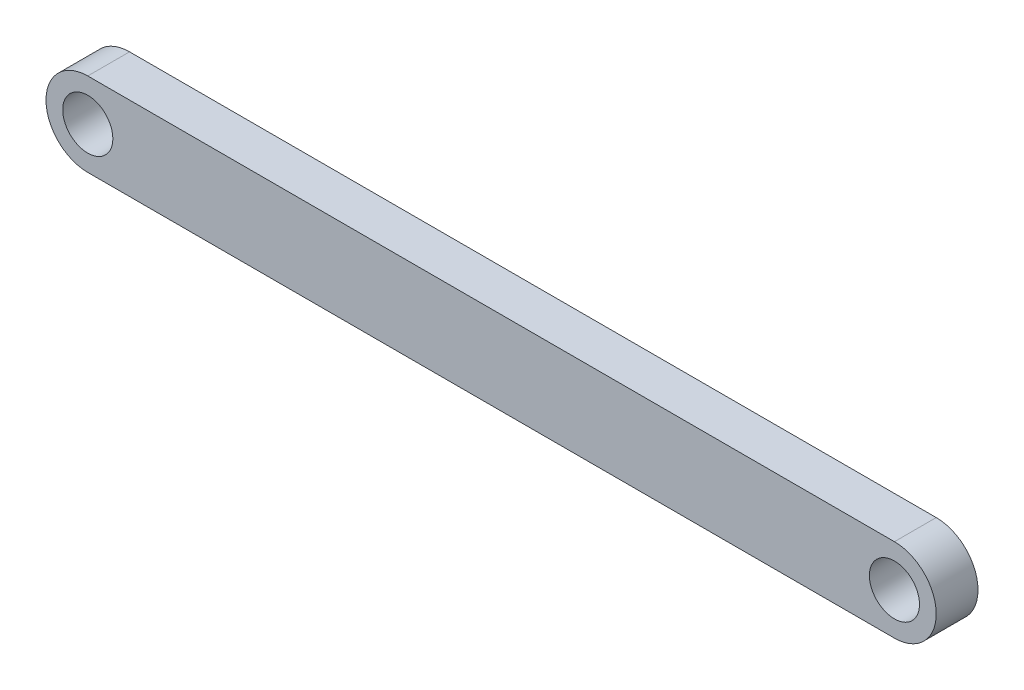
ISO-10303-21;
HEADER;
FILE_DESCRIPTION(('STEP AP214'),'2;1');
FILE_NAME('part.step','',(''),(''),'','','');
FILE_SCHEMA(('AUTOMOTIVE_DESIGN { 1 0 10303 214 1 1 1 1 }'));
ENDSEC;
DATA;
#1=APPLICATION_CONTEXT('core data for automotive mechanical design processes');
#2=APPLICATION_PROTOCOL_DEFINITION('international standard','automotive_design',2000,#1);
#3=PRODUCT_CONTEXT('',#1,'mechanical');
#4=PRODUCT('Part','Part','',(#3));
#5=PRODUCT_RELATED_PRODUCT_CATEGORY('part','',(#4));
#6=PRODUCT_DEFINITION_FORMATION('','',#4);
#7=PRODUCT_DEFINITION_CONTEXT('part definition',#1,'design');
#8=PRODUCT_DEFINITION('design','',#6,#7);
#9=PRODUCT_DEFINITION_SHAPE('','',#8);
#10=(LENGTH_UNIT() NAMED_UNIT(*) SI_UNIT(.MILLI.,.METRE.));
#11=(NAMED_UNIT(*) PLANE_ANGLE_UNIT() SI_UNIT($,.RADIAN.));
#12=(NAMED_UNIT(*) SI_UNIT($,.STERADIAN.) SOLID_ANGLE_UNIT());
#13=UNCERTAINTY_MEASURE_WITH_UNIT(LENGTH_MEASURE(1.E-05),#10,'distance_accuracy_value','');
#14=(GEOMETRIC_REPRESENTATION_CONTEXT(3) GLOBAL_UNCERTAINTY_ASSIGNED_CONTEXT((#13)) GLOBAL_UNIT_ASSIGNED_CONTEXT((#10,
#11,#12)) REPRESENTATION_CONTEXT('',''));
#15=CARTESIAN_POINT('',(0.,0.,0.));
#16=DIRECTION('',(0.,0.,1.));
#17=DIRECTION('',(1.,0.,0.));
#18=AXIS2_PLACEMENT_3D('',#15,#16,#17);
#19=CARTESIAN_POINT('',(48.27,0.,5.));
#20=DIRECTION('',(0.,0.,-1.));
#21=DIRECTION('',(-1.,0.,0.));
#22=AXIS2_PLACEMENT_3D('',#19,#20,#21);
#23=PLANE('',#22);
#24=CARTESIAN_POINT('',(48.27,0.,5.));
#25=DIRECTION('',(0.,0.,1.));
#26=DIRECTION('',(-1.,0.,0.));
#27=AXIS2_PLACEMENT_3D('',#24,#25,#26);
#28=CIRCLE('',#27,5.);
#29=CARTESIAN_POINT('',(48.27,-5.,5.));
#30=VERTEX_POINT('',#29);
#31=CARTESIAN_POINT('',(48.27,5.,5.));
#32=VERTEX_POINT('',#31);
#33=EDGE_CURVE('E91',#30,#32,#28,.T.);
#34=ORIENTED_EDGE('',*,*,#33,.T.);
#35=DIRECTION('',(-1.,0.,0.));
#36=VECTOR('',#35,1.);
#37=CARTESIAN_POINT('',(-48.27,5.,5.));
#38=LINE('',#37,#36);
#39=CARTESIAN_POINT('',(-48.27,5.,5.));
#40=VERTEX_POINT('',#39);
#41=EDGE_CURVE('E86',#32,#40,#38,.T.);
#42=ORIENTED_EDGE('',*,*,#41,.T.);
#43=CARTESIAN_POINT('',(-48.27,0.,5.));
#44=DIRECTION('',(0.,0.,1.));
#45=DIRECTION('',(1.,0.,0.));
#46=AXIS2_PLACEMENT_3D('',#43,#44,#45);
#47=CIRCLE('',#46,5.);
#48=CARTESIAN_POINT('',(-48.27,-5.,5.));
#49=VERTEX_POINT('',#48);
#50=EDGE_CURVE('E89',#40,#49,#47,.T.);
#51=ORIENTED_EDGE('',*,*,#50,.T.);
#52=DIRECTION('',(1.,0.,0.));
#53=VECTOR('',#52,1.);
#54=CARTESIAN_POINT('',(-48.27,-5.,5.));
#55=LINE('',#54,#53);
#56=EDGE_CURVE('E56',#49,#30,#55,.T.);
#57=ORIENTED_EDGE('',*,*,#56,.T.);
#58=EDGE_LOOP('',(#34,#42,#51,#57));
#59=FACE_BOUND('',#58,.T.);
#60=CARTESIAN_POINT('',(-48.27,0.,5.));
#61=DIRECTION('',(0.,0.,1.));
#62=DIRECTION('',(1.,0.,0.));
#63=AXIS2_PLACEMENT_3D('',#60,#61,#62);
#64=CIRCLE('',#63,3.);
#65=CARTESIAN_POINT('',(-45.27,0.,5.));
#66=VERTEX_POINT('',#65);
#67=EDGE_CURVE('E106',#66,#66,#64,.T.);
#68=ORIENTED_EDGE('',*,*,#67,.F.);
#69=EDGE_LOOP('',(#68));
#70=FACE_BOUND('',#69,.T.);
#71=CARTESIAN_POINT('',(48.27,0.,5.));
#72=DIRECTION('',(0.,0.,1.));
#73=DIRECTION('',(1.,0.,0.));
#74=AXIS2_PLACEMENT_3D('',#71,#72,#73);
#75=CIRCLE('',#74,3.);
#76=CARTESIAN_POINT('',(51.27,0.,5.));
#77=VERTEX_POINT('',#76);
#78=EDGE_CURVE('E121',#77,#77,#75,.T.);
#79=ORIENTED_EDGE('',*,*,#78,.F.);
#80=EDGE_LOOP('',(#79));
#81=FACE_BOUND('',#80,.T.);
#82=ADVANCED_FACE('F39',(#59,#70,#81),#23,.F.);
#83=CARTESIAN_POINT('',(48.27,0.,0.));
#84=DIRECTION('',(0.,0.,-1.));
#85=DIRECTION('',(-1.,0.,0.));
#86=AXIS2_PLACEMENT_3D('',#83,#84,#85);
#87=PLANE('',#86);
#88=CARTESIAN_POINT('',(-48.27,0.,0.));
#89=DIRECTION('',(0.,0.,1.));
#90=DIRECTION('',(1.,0.,0.));
#91=AXIS2_PLACEMENT_3D('',#88,#89,#90);
#92=CIRCLE('',#91,3.);
#93=CARTESIAN_POINT('',(-45.27,0.,0.));
#94=VERTEX_POINT('',#93);
#95=EDGE_CURVE('E118',#94,#94,#92,.T.);
#96=ORIENTED_EDGE('',*,*,#95,.T.);
#97=EDGE_LOOP('',(#96));
#98=FACE_BOUND('',#97,.T.);
#99=CARTESIAN_POINT('',(48.27,0.,0.));
#100=DIRECTION('',(0.,0.,1.));
#101=DIRECTION('',(-1.,0.,0.));
#102=AXIS2_PLACEMENT_3D('',#99,#100,#101);
#103=CIRCLE('',#102,5.);
#104=CARTESIAN_POINT('',(48.27,-5.,0.));
#105=VERTEX_POINT('',#104);
#106=CARTESIAN_POINT('',(48.27,5.,0.));
#107=VERTEX_POINT('',#106);
#108=EDGE_CURVE('E103',#105,#107,#103,.T.);
#109=ORIENTED_EDGE('',*,*,#108,.F.);
#110=DIRECTION('',(1.,0.,0.));
#111=VECTOR('',#110,1.);
#112=CARTESIAN_POINT('',(-48.27,-5.,0.));
#113=LINE('',#112,#111);
#114=CARTESIAN_POINT('',(-48.27,-5.,0.));
#115=VERTEX_POINT('',#114);
#116=EDGE_CURVE('E79',#115,#105,#113,.T.);
#117=ORIENTED_EDGE('',*,*,#116,.F.);
#118=CARTESIAN_POINT('',(-48.27,0.,0.));
#119=DIRECTION('',(0.,0.,1.));
#120=DIRECTION('',(1.,0.,0.));
#121=AXIS2_PLACEMENT_3D('',#118,#119,#120);
#122=CIRCLE('',#121,5.);
#123=CARTESIAN_POINT('',(-48.27,5.,0.));
#124=VERTEX_POINT('',#123);
#125=EDGE_CURVE('E73',#124,#115,#122,.T.);
#126=ORIENTED_EDGE('',*,*,#125,.F.);
#127=DIRECTION('',(-1.,0.,0.));
#128=VECTOR('',#127,1.);
#129=CARTESIAN_POINT('',(-48.27,5.,0.));
#130=LINE('',#129,#128);
#131=EDGE_CURVE('E95',#107,#124,#130,.T.);
#132=ORIENTED_EDGE('',*,*,#131,.F.);
#133=EDGE_LOOP('',(#109,#117,#126,#132));
#134=FACE_BOUND('',#133,.T.);
#135=CARTESIAN_POINT('',(48.27,0.,0.));
#136=DIRECTION('',(0.,0.,1.));
#137=DIRECTION('',(1.,0.,0.));
#138=AXIS2_PLACEMENT_3D('',#135,#136,#137);
#139=CIRCLE('',#138,3.);
#140=CARTESIAN_POINT('',(51.27,0.,0.));
#141=VERTEX_POINT('',#140);
#142=EDGE_CURVE('E124',#141,#141,#139,.T.);
#143=ORIENTED_EDGE('',*,*,#142,.T.);
#144=EDGE_LOOP('',(#143));
#145=FACE_BOUND('',#144,.T.);
#146=ADVANCED_FACE('F114',(#98,#134,#145),#87,.T.);
#147=CARTESIAN_POINT('',(48.27,0.,5.));
#148=DIRECTION('',(0.,0.,-1.));
#149=DIRECTION('',(-1.,0.,0.));
#150=AXIS2_PLACEMENT_3D('',#147,#148,#149);
#151=CYLINDRICAL_SURFACE('',#150,5.);
#152=ORIENTED_EDGE('',*,*,#108,.T.);
#153=DIRECTION('',(0.,0.,-1.));
#154=VECTOR('',#153,1.);
#155=CARTESIAN_POINT('',(48.27,5.,5.));
#156=LINE('',#155,#154);
#157=EDGE_CURVE('E11',#32,#107,#156,.T.);
#158=ORIENTED_EDGE('',*,*,#157,.F.);
#159=ORIENTED_EDGE('',*,*,#33,.F.);
#160=DIRECTION('',(0.,0.,-1.));
#161=VECTOR('',#160,1.);
#162=CARTESIAN_POINT('',(48.27,-5.,5.));
#163=LINE('',#162,#161);
#164=EDGE_CURVE('E99',#30,#105,#163,.T.);
#165=ORIENTED_EDGE('',*,*,#164,.T.);
#166=EDGE_LOOP('',(#152,#158,#159,#165));
#167=FACE_BOUND('',#166,.T.);
#168=ADVANCED_FACE('F41',(#167),#151,.T.);
#169=CARTESIAN_POINT('',(-48.27,5.,5.));
#170=DIRECTION('',(0.,-1.,0.));
#171=DIRECTION('',(0.,0.,-1.));
#172=AXIS2_PLACEMENT_3D('',#169,#170,#171);
#173=PLANE('',#172);
#174=ORIENTED_EDGE('',*,*,#131,.T.);
#175=DIRECTION('',(0.,0.,-1.));
#176=VECTOR('',#175,1.);
#177=CARTESIAN_POINT('',(-48.27,5.,5.));
#178=LINE('',#177,#176);
#179=EDGE_CURVE('E48',#40,#124,#178,.T.);
#180=ORIENTED_EDGE('',*,*,#179,.F.);
#181=ORIENTED_EDGE('',*,*,#41,.F.);
#182=ORIENTED_EDGE('',*,*,#157,.T.);
#183=EDGE_LOOP('',(#174,#180,#181,#182));
#184=FACE_BOUND('',#183,.T.);
#185=ADVANCED_FACE('F94',(#184),#173,.F.);
#186=CARTESIAN_POINT('',(-48.27,0.,5.));
#187=DIRECTION('',(0.,0.,-1.));
#188=DIRECTION('',(-1.,0.,0.));
#189=AXIS2_PLACEMENT_3D('',#186,#187,#188);
#190=CYLINDRICAL_SURFACE('',#189,5.);
#191=ORIENTED_EDGE('',*,*,#125,.T.);
#192=DIRECTION('',(0.,0.,-1.));
#193=VECTOR('',#192,1.);
#194=CARTESIAN_POINT('',(-48.27,-5.,5.));
#195=LINE('',#194,#193);
#196=EDGE_CURVE('E96',#49,#115,#195,.T.);
#197=ORIENTED_EDGE('',*,*,#196,.F.);
#198=ORIENTED_EDGE('',*,*,#50,.F.);
#199=ORIENTED_EDGE('',*,*,#179,.T.);
#200=EDGE_LOOP('',(#191,#197,#198,#199));
#201=FACE_BOUND('',#200,.T.);
#202=ADVANCED_FACE('F97',(#201),#190,.T.);
#203=CARTESIAN_POINT('',(-48.27,-5.,5.));
#204=DIRECTION('',(0.,1.,0.));
#205=DIRECTION('',(0.,0.,1.));
#206=AXIS2_PLACEMENT_3D('',#203,#204,#205);
#207=PLANE('',#206);
#208=ORIENTED_EDGE('',*,*,#116,.T.);
#209=ORIENTED_EDGE('',*,*,#164,.F.);
#210=ORIENTED_EDGE('',*,*,#56,.F.);
#211=ORIENTED_EDGE('',*,*,#196,.T.);
#212=EDGE_LOOP('',(#208,#209,#210,#211));
#213=FACE_BOUND('',#212,.T.);
#214=ADVANCED_FACE('F111',(#213),#207,.F.);
#215=CARTESIAN_POINT('',(-48.27,0.,5.));
#216=DIRECTION('',(0.,0.,-1.));
#217=DIRECTION('',(-1.,0.,0.));
#218=AXIS2_PLACEMENT_3D('',#215,#216,#217);
#219=CYLINDRICAL_SURFACE('',#218,3.);
#220=ORIENTED_EDGE('',*,*,#67,.T.);
#221=EDGE_LOOP('',(#220));
#222=FACE_BOUND('',#221,.T.);
#223=ORIENTED_EDGE('',*,*,#95,.F.);
#224=EDGE_LOOP('',(#223));
#225=FACE_BOUND('',#224,.T.);
#226=ADVANCED_FACE('F141',(#222,#225),#219,.F.);
#227=CARTESIAN_POINT('',(48.27,0.,5.));
#228=DIRECTION('',(0.,0.,-1.));
#229=DIRECTION('',(-1.,0.,0.));
#230=AXIS2_PLACEMENT_3D('',#227,#228,#229);
#231=CYLINDRICAL_SURFACE('',#230,3.);
#232=ORIENTED_EDGE('',*,*,#78,.T.);
#233=EDGE_LOOP('',(#232));
#234=FACE_BOUND('',#233,.T.);
#235=ORIENTED_EDGE('',*,*,#142,.F.);
#236=EDGE_LOOP('',(#235));
#237=FACE_BOUND('',#236,.T.);
#238=ADVANCED_FACE('F130',(#234,#237),#231,.F.);
#239=CLOSED_SHELL('',(#82,#146,#168,#185,#202,#214,#226,#238));
#240=MANIFOLD_SOLID_BREP('B2',#239);
#241=ADVANCED_BREP_SHAPE_REPRESENTATION('',(#18,#240),#14);
#242=SHAPE_DEFINITION_REPRESENTATION(#9,#241);
ENDSEC;
END-ISO-10303-21;
